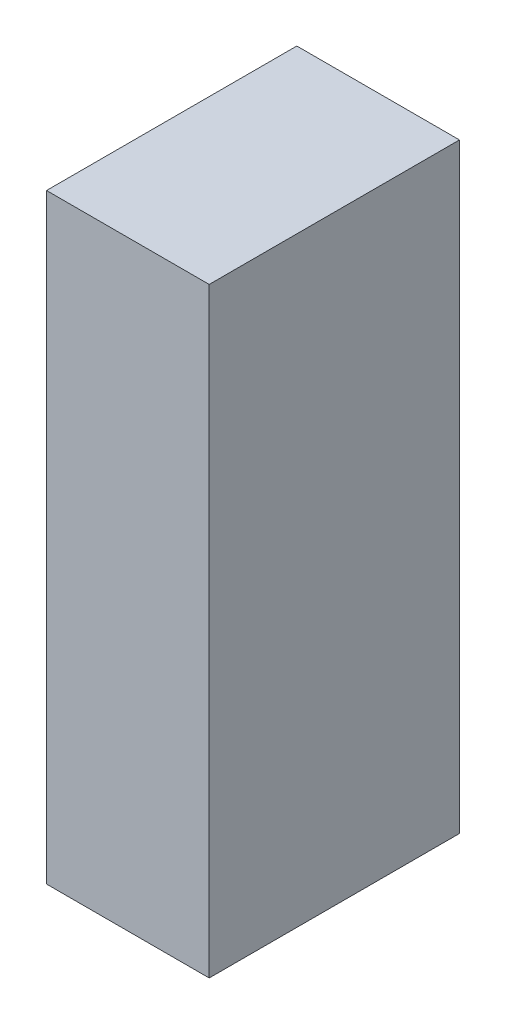
ISO-10303-21;
HEADER;
FILE_DESCRIPTION(('STEP AP214'),'2;1');
FILE_NAME('part.step','',(''),(''),'','','');
FILE_SCHEMA(('AUTOMOTIVE_DESIGN { 1 0 10303 214 1 1 1 1 }'));
ENDSEC;
DATA;
#1=APPLICATION_CONTEXT('core data for automotive mechanical design processes');
#2=APPLICATION_PROTOCOL_DEFINITION('international standard','automotive_design',2000,#1);
#3=PRODUCT_CONTEXT('',#1,'mechanical');
#4=PRODUCT('Part','Part','',(#3));
#5=PRODUCT_RELATED_PRODUCT_CATEGORY('part','',(#4));
#6=PRODUCT_DEFINITION_FORMATION('','',#4);
#7=PRODUCT_DEFINITION_CONTEXT('part definition',#1,'design');
#8=PRODUCT_DEFINITION('design','',#6,#7);
#9=PRODUCT_DEFINITION_SHAPE('','',#8);
#10=(LENGTH_UNIT() NAMED_UNIT(*) SI_UNIT(.MILLI.,.METRE.));
#11=(NAMED_UNIT(*) PLANE_ANGLE_UNIT() SI_UNIT($,.RADIAN.));
#12=(NAMED_UNIT(*) SI_UNIT($,.STERADIAN.) SOLID_ANGLE_UNIT());
#13=UNCERTAINTY_MEASURE_WITH_UNIT(LENGTH_MEASURE(1.E-05),#10,'distance_accuracy_value','');
#14=(GEOMETRIC_REPRESENTATION_CONTEXT(3) GLOBAL_UNCERTAINTY_ASSIGNED_CONTEXT((#13)) GLOBAL_UNIT_ASSIGNED_CONTEXT((#10,
#11,#12)) REPRESENTATION_CONTEXT('',''));
#15=CARTESIAN_POINT('',(0.,0.,0.));
#16=DIRECTION('',(0.,0.,1.));
#17=DIRECTION('',(1.,0.,0.));
#18=AXIS2_PLACEMENT_3D('',#15,#16,#17);
#19=CARTESIAN_POINT('',(0.,0.,100.));
#20=DIRECTION('',(-1.,0.,0.));
#21=DIRECTION('',(0.,0.,1.));
#22=AXIS2_PLACEMENT_3D('',#19,#20,#21);
#23=PLANE('',#22);
#24=DIRECTION('',(0.,1.,0.));
#25=VECTOR('',#24,1.);
#26=CARTESIAN_POINT('',(0.,0.,0.));
#27=LINE('',#26,#25);
#28=CARTESIAN_POINT('',(0.,0.,0.));
#29=VERTEX_POINT('',#28);
#30=CARTESIAN_POINT('',(0.,240.,0.));
#31=VERTEX_POINT('',#30);
#32=EDGE_CURVE('E96',#29,#31,#27,.T.);
#33=ORIENTED_EDGE('',*,*,#32,.T.);
#34=DIRECTION('',(0.,0.,-1.));
#35=VECTOR('',#34,1.);
#36=CARTESIAN_POINT('',(0.,240.,100.));
#37=LINE('',#36,#35);
#38=CARTESIAN_POINT('',(0.,240.,100.));
#39=VERTEX_POINT('',#38);
#40=EDGE_CURVE('E11',#39,#31,#37,.T.);
#41=ORIENTED_EDGE('',*,*,#40,.F.);
#42=DIRECTION('',(0.,1.,0.));
#43=VECTOR('',#42,1.);
#44=CARTESIAN_POINT('',(0.,0.,100.));
#45=LINE('',#44,#43);
#46=CARTESIAN_POINT('',(0.,0.,100.));
#47=VERTEX_POINT('',#46);
#48=EDGE_CURVE('E84',#47,#39,#45,.T.);
#49=ORIENTED_EDGE('',*,*,#48,.F.);
#50=DIRECTION('',(0.,0.,-1.));
#51=VECTOR('',#50,1.);
#52=CARTESIAN_POINT('',(0.,0.,100.));
#53=LINE('',#52,#51);
#54=EDGE_CURVE('E92',#47,#29,#53,.T.);
#55=ORIENTED_EDGE('',*,*,#54,.T.);
#56=EDGE_LOOP('',(#33,#41,#49,#55));
#57=FACE_BOUND('',#56,.T.);
#58=ADVANCED_FACE('F33',(#57),#23,.F.);
#59=CARTESIAN_POINT('',(0.,240.,100.));
#60=DIRECTION('',(0.,-1.,0.));
#61=DIRECTION('',(1.,0.,0.));
#62=AXIS2_PLACEMENT_3D('',#59,#60,#61);
#63=PLANE('',#62);
#64=DIRECTION('',(-1.,0.,0.));
#65=VECTOR('',#64,1.);
#66=CARTESIAN_POINT('',(0.,240.,0.));
#67=LINE('',#66,#65);
#68=CARTESIAN_POINT('',(-64.9999999999999,240.,0.));
#69=VERTEX_POINT('',#68);
#70=EDGE_CURVE('E88',#31,#69,#67,.T.);
#71=ORIENTED_EDGE('',*,*,#70,.T.);
#72=DIRECTION('',(0.,0.,-1.));
#73=VECTOR('',#72,1.);
#74=CARTESIAN_POINT('',(-64.9999999999999,240.,100.));
#75=LINE('',#74,#73);
#76=CARTESIAN_POINT('',(-64.9999999999999,240.,100.));
#77=VERTEX_POINT('',#76);
#78=EDGE_CURVE('E41',#77,#69,#75,.T.);
#79=ORIENTED_EDGE('',*,*,#78,.F.);
#80=DIRECTION('',(-1.,0.,0.));
#81=VECTOR('',#80,1.);
#82=CARTESIAN_POINT('',(0.,240.,100.));
#83=LINE('',#82,#81);
#84=EDGE_CURVE('E79',#39,#77,#83,.T.);
#85=ORIENTED_EDGE('',*,*,#84,.F.);
#86=ORIENTED_EDGE('',*,*,#40,.T.);
#87=EDGE_LOOP('',(#71,#79,#85,#86));
#88=FACE_BOUND('',#87,.T.);
#89=ADVANCED_FACE('F87',(#88),#63,.F.);
#90=CARTESIAN_POINT('',(-64.9999999999999,0.,100.));
#91=DIRECTION('',(1.,0.,0.));
#92=DIRECTION('',(0.,0.,-1.));
#93=AXIS2_PLACEMENT_3D('',#90,#91,#92);
#94=PLANE('',#93);
#95=DIRECTION('',(0.,-1.,0.));
#96=VECTOR('',#95,1.);
#97=CARTESIAN_POINT('',(-64.9999999999999,0.,0.));
#98=LINE('',#97,#96);
#99=CARTESIAN_POINT('',(-64.9999999999999,0.,0.));
#100=VERTEX_POINT('',#99);
#101=EDGE_CURVE('E66',#69,#100,#98,.T.);
#102=ORIENTED_EDGE('',*,*,#101,.T.);
#103=DIRECTION('',(0.,0.,-1.));
#104=VECTOR('',#103,1.);
#105=CARTESIAN_POINT('',(-64.9999999999999,0.,100.));
#106=LINE('',#105,#104);
#107=CARTESIAN_POINT('',(-64.9999999999999,0.,100.));
#108=VERTEX_POINT('',#107);
#109=EDGE_CURVE('E89',#108,#100,#106,.T.);
#110=ORIENTED_EDGE('',*,*,#109,.F.);
#111=DIRECTION('',(0.,-1.,0.));
#112=VECTOR('',#111,1.);
#113=CARTESIAN_POINT('',(-64.9999999999999,0.,100.));
#114=LINE('',#113,#112);
#115=EDGE_CURVE('E82',#77,#108,#114,.T.);
#116=ORIENTED_EDGE('',*,*,#115,.F.);
#117=ORIENTED_EDGE('',*,*,#78,.T.);
#118=EDGE_LOOP('',(#102,#110,#116,#117));
#119=FACE_BOUND('',#118,.T.);
#120=ADVANCED_FACE('F90',(#119),#94,.F.);
#121=CARTESIAN_POINT('',(0.,0.,100.));
#122=DIRECTION('',(0.,1.,0.));
#123=DIRECTION('',(-1.,0.,0.));
#124=AXIS2_PLACEMENT_3D('',#121,#122,#123);
#125=PLANE('',#124);
#126=DIRECTION('',(1.,0.,0.));
#127=VECTOR('',#126,1.);
#128=CARTESIAN_POINT('',(0.,0.,0.));
#129=LINE('',#128,#127);
#130=EDGE_CURVE('E72',#100,#29,#129,.T.);
#131=ORIENTED_EDGE('',*,*,#130,.T.);
#132=ORIENTED_EDGE('',*,*,#54,.F.);
#133=DIRECTION('',(1.,0.,0.));
#134=VECTOR('',#133,1.);
#135=CARTESIAN_POINT('',(0.,0.,100.));
#136=LINE('',#135,#134);
#137=EDGE_CURVE('E49',#108,#47,#136,.T.);
#138=ORIENTED_EDGE('',*,*,#137,.F.);
#139=ORIENTED_EDGE('',*,*,#109,.T.);
#140=EDGE_LOOP('',(#131,#132,#138,#139));
#141=FACE_BOUND('',#140,.T.);
#142=ADVANCED_FACE('F103',(#141),#125,.F.);
#143=CARTESIAN_POINT('',(0.,0.,100.));
#144=DIRECTION('',(0.,0.,1.));
#145=DIRECTION('',(1.,0.,0.));
#146=AXIS2_PLACEMENT_3D('',#143,#144,#145);
#147=PLANE('',#146);
#148=ORIENTED_EDGE('',*,*,#48,.T.);
#149=ORIENTED_EDGE('',*,*,#84,.T.);
#150=ORIENTED_EDGE('',*,*,#115,.T.);
#151=ORIENTED_EDGE('',*,*,#137,.T.);
#152=EDGE_LOOP('',(#148,#149,#150,#151));
#153=FACE_BOUND('',#152,.T.);
#154=ADVANCED_FACE('F80',(#153),#147,.T.);
#155=CARTESIAN_POINT('',(0.,0.,0.));
#156=DIRECTION('',(0.,0.,1.));
#157=DIRECTION('',(1.,0.,0.));
#158=AXIS2_PLACEMENT_3D('',#155,#156,#157);
#159=PLANE('',#158);
#160=ORIENTED_EDGE('',*,*,#32,.F.);
#161=ORIENTED_EDGE('',*,*,#130,.F.);
#162=ORIENTED_EDGE('',*,*,#101,.F.);
#163=ORIENTED_EDGE('',*,*,#70,.F.);
#164=EDGE_LOOP('',(#160,#161,#162,#163));
#165=FACE_BOUND('',#164,.T.);
#166=ADVANCED_FACE('F106',(#165),#159,.F.);
#167=CLOSED_SHELL('',(#58,#89,#120,#142,#154,#166));
#168=MANIFOLD_SOLID_BREP('B2',#167);
#169=ADVANCED_BREP_SHAPE_REPRESENTATION('',(#18,#168),#14);
#170=SHAPE_DEFINITION_REPRESENTATION(#9,#169);
ENDSEC;
END-ISO-10303-21;
